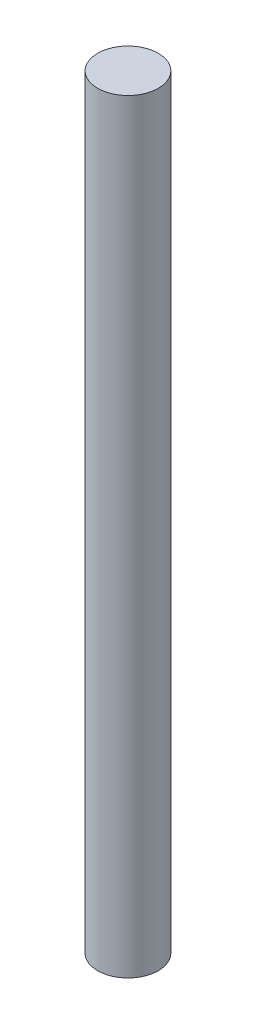
ISO-10303-21;
HEADER;
FILE_DESCRIPTION(('STEP AP214'),'2;1');
FILE_NAME('part.step','',(''),(''),'','','');
FILE_SCHEMA(('AUTOMOTIVE_DESIGN { 1 0 10303 214 1 1 1 1 }'));
ENDSEC;
DATA;
#1=APPLICATION_CONTEXT('core data for automotive mechanical design processes');
#2=APPLICATION_PROTOCOL_DEFINITION('international standard','automotive_design',2000,#1);
#3=PRODUCT_CONTEXT('',#1,'mechanical');
#4=PRODUCT('Part','Part','',(#3));
#5=PRODUCT_RELATED_PRODUCT_CATEGORY('part','',(#4));
#6=PRODUCT_DEFINITION_FORMATION('','',#4);
#7=PRODUCT_DEFINITION_CONTEXT('part definition',#1,'design');
#8=PRODUCT_DEFINITION('design','',#6,#7);
#9=PRODUCT_DEFINITION_SHAPE('','',#8);
#10=(LENGTH_UNIT() NAMED_UNIT(*) SI_UNIT(.MILLI.,.METRE.));
#11=(NAMED_UNIT(*) PLANE_ANGLE_UNIT() SI_UNIT($,.RADIAN.));
#12=(NAMED_UNIT(*) SI_UNIT($,.STERADIAN.) SOLID_ANGLE_UNIT());
#13=UNCERTAINTY_MEASURE_WITH_UNIT(LENGTH_MEASURE(1.E-05),#10,'distance_accuracy_value','');
#14=(GEOMETRIC_REPRESENTATION_CONTEXT(3) GLOBAL_UNCERTAINTY_ASSIGNED_CONTEXT((#13)) GLOBAL_UNIT_ASSIGNED_CONTEXT((#10,
#11,#12)) REPRESENTATION_CONTEXT('',''));
#15=CARTESIAN_POINT('',(0.,0.,0.));
#16=DIRECTION('',(0.,0.,1.));
#17=DIRECTION('',(1.,0.,0.));
#18=AXIS2_PLACEMENT_3D('',#15,#16,#17);
#19=CARTESIAN_POINT('',(0.,80.,0.));
#20=DIRECTION('',(0.,-1.,0.));
#21=DIRECTION('',(0.,0.,-1.));
#22=AXIS2_PLACEMENT_3D('',#19,#20,#21);
#23=CYLINDRICAL_SURFACE('',#22,3.175);
#24=CARTESIAN_POINT('',(0.,80.,0.));
#25=DIRECTION('',(0.,1.,0.));
#26=DIRECTION('',(0.,0.,1.));
#27=AXIS2_PLACEMENT_3D('',#24,#25,#26);
#28=CIRCLE('',#27,3.175);
#29=CARTESIAN_POINT('',(0.,80.,3.175));
#30=VERTEX_POINT('',#29);
#31=EDGE_CURVE('E10',#30,#30,#28,.T.);
#32=ORIENTED_EDGE('',*,*,#31,.F.);
#33=EDGE_LOOP('',(#32));
#34=FACE_BOUND('',#33,.T.);
#35=CARTESIAN_POINT('',(0.,0.,0.));
#36=DIRECTION('',(0.,1.,0.));
#37=DIRECTION('',(0.,0.,1.));
#38=AXIS2_PLACEMENT_3D('',#35,#36,#37);
#39=CIRCLE('',#38,3.175);
#40=CARTESIAN_POINT('',(0.,0.,3.175));
#41=VERTEX_POINT('',#40);
#42=EDGE_CURVE('E46',#41,#41,#39,.T.);
#43=ORIENTED_EDGE('',*,*,#42,.T.);
#44=EDGE_LOOP('',(#43));
#45=FACE_BOUND('',#44,.T.);
#46=ADVANCED_FACE('F43',(#34,#45),#23,.T.);
#47=CARTESIAN_POINT('',(0.,80.,0.));
#48=DIRECTION('',(0.,1.,0.));
#49=DIRECTION('',(0.,0.,1.));
#50=AXIS2_PLACEMENT_3D('',#47,#48,#49);
#51=PLANE('',#50);
#52=ORIENTED_EDGE('',*,*,#31,.T.);
#53=EDGE_LOOP('',(#52));
#54=FACE_BOUND('',#53,.T.);
#55=ADVANCED_FACE('F60',(#54),#51,.T.);
#56=CARTESIAN_POINT('',(0.,0.,0.));
#57=DIRECTION('',(0.,1.,0.));
#58=DIRECTION('',(0.,0.,1.));
#59=AXIS2_PLACEMENT_3D('',#56,#57,#58);
#60=PLANE('',#59);
#61=ORIENTED_EDGE('',*,*,#42,.F.);
#62=EDGE_LOOP('',(#61));
#63=FACE_BOUND('',#62,.T.);
#64=ADVANCED_FACE('F58',(#63),#60,.F.);
#65=CLOSED_SHELL('',(#46,#55,#64));
#66=MANIFOLD_SOLID_BREP('B2',#65);
#67=ADVANCED_BREP_SHAPE_REPRESENTATION('',(#18,#66),#14);
#68=SHAPE_DEFINITION_REPRESENTATION(#9,#67);
ENDSEC;
END-ISO-10303-21;
